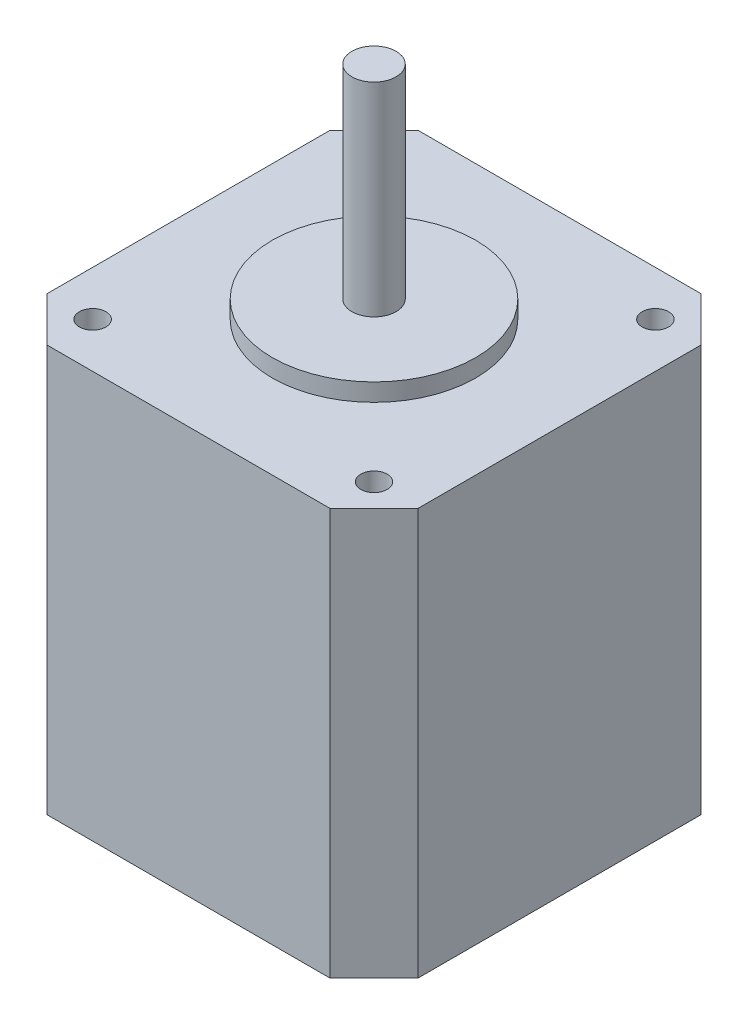
ISO-10303-21;
HEADER;
FILE_DESCRIPTION(('STEP AP214'),'2;1');
FILE_NAME('part.step','',(''),(''),'','','');
FILE_SCHEMA(('AUTOMOTIVE_DESIGN { 1 0 10303 214 1 1 1 1 }'));
ENDSEC;
DATA;
#1=APPLICATION_CONTEXT('core data for automotive mechanical design processes');
#2=APPLICATION_PROTOCOL_DEFINITION('international standard','automotive_design',2000,#1);
#3=PRODUCT_CONTEXT('',#1,'mechanical');
#4=PRODUCT('Part','Part','',(#3));
#5=PRODUCT_RELATED_PRODUCT_CATEGORY('part','',(#4));
#6=PRODUCT_DEFINITION_FORMATION('','',#4);
#7=PRODUCT_DEFINITION_CONTEXT('part definition',#1,'design');
#8=PRODUCT_DEFINITION('design','',#6,#7);
#9=PRODUCT_DEFINITION_SHAPE('','',#8);
#10=(LENGTH_UNIT() NAMED_UNIT(*) SI_UNIT(.MILLI.,.METRE.));
#11=(NAMED_UNIT(*) PLANE_ANGLE_UNIT() SI_UNIT($,.RADIAN.));
#12=(NAMED_UNIT(*) SI_UNIT($,.STERADIAN.) SOLID_ANGLE_UNIT());
#13=UNCERTAINTY_MEASURE_WITH_UNIT(LENGTH_MEASURE(1.E-05),#10,'distance_accuracy_value','');
#14=(GEOMETRIC_REPRESENTATION_CONTEXT(3) GLOBAL_UNCERTAINTY_ASSIGNED_CONTEXT((#13)) GLOBAL_UNIT_ASSIGNED_CONTEXT((#10,
#11,#12)) REPRESENTATION_CONTEXT('',''));
#15=CARTESIAN_POINT('',(0.,0.,0.));
#16=DIRECTION('',(0.,0.,1.));
#17=DIRECTION('',(1.,0.,0.));
#18=AXIS2_PLACEMENT_3D('',#15,#16,#17);
#19=CARTESIAN_POINT('',(0.,48.,0.));
#20=DIRECTION('',(0.,1.,0.));
#21=DIRECTION('',(0.,0.,1.));
#22=AXIS2_PLACEMENT_3D('',#19,#20,#21);
#23=PLANE('',#22);
#24=CARTESIAN_POINT('',(0.,48.,0.));
#25=DIRECTION('',(0.,1.,0.));
#26=DIRECTION('',(0.,0.,1.));
#27=AXIS2_PLACEMENT_3D('',#24,#25,#26);
#28=CIRCLE('',#27,11.5);
#29=CARTESIAN_POINT('',(0.,48.,11.5));
#30=VERTEX_POINT('',#29);
#31=EDGE_CURVE('E178',#30,#30,#28,.T.);
#32=ORIENTED_EDGE('',*,*,#31,.T.);
#33=EDGE_LOOP('',(#32));
#34=FACE_BOUND('',#33,.T.);
#35=CARTESIAN_POINT('',(0.,48.,0.));
#36=DIRECTION('',(0.,1.,0.));
#37=DIRECTION('',(0.,0.,1.));
#38=AXIS2_PLACEMENT_3D('',#35,#36,#37);
#39=CIRCLE('',#38,2.5);
#40=CARTESIAN_POINT('',(0.,48.,2.5));
#41=VERTEX_POINT('',#40);
#42=EDGE_CURVE('E37',#41,#41,#39,.F.);
#43=ORIENTED_EDGE('',*,*,#42,.T.);
#44=EDGE_LOOP('',(#43));
#45=FACE_BOUND('',#44,.T.);
#46=ADVANCED_FACE('F33',(#34,#45),#23,.T.);
#47=CARTESIAN_POINT('',(0.,46.,0.));
#48=DIRECTION('',(0.,-1.,0.));
#49=DIRECTION('',(0.,0.,-1.));
#50=AXIS2_PLACEMENT_3D('',#47,#48,#49);
#51=PLANE('',#50);
#52=CARTESIAN_POINT('',(-15.9099025766973,46.,15.9099025766973));
#53=DIRECTION('',(0.,1.,0.));
#54=DIRECTION('',(0.,0.,1.));
#55=AXIS2_PLACEMENT_3D('',#52,#53,#54);
#56=CIRCLE('',#55,1.5);
#57=CARTESIAN_POINT('',(-15.9099025766973,46.,17.4099025766973));
#58=VERTEX_POINT('',#57);
#59=EDGE_CURVE('E212',#58,#58,#56,.T.);
#60=ORIENTED_EDGE('',*,*,#59,.F.);
#61=EDGE_LOOP('',(#60));
#62=FACE_BOUND('',#61,.T.);
#63=CARTESIAN_POINT('',(15.9099025766973,46.,15.9099025766973));
#64=DIRECTION('',(0.,1.,0.));
#65=DIRECTION('',(0.,0.,1.));
#66=AXIS2_PLACEMENT_3D('',#63,#64,#65);
#67=CIRCLE('',#66,1.5);
#68=CARTESIAN_POINT('',(15.9099025766973,46.,17.4099025766973));
#69=VERTEX_POINT('',#68);
#70=EDGE_CURVE('E206',#69,#69,#67,.T.);
#71=ORIENTED_EDGE('',*,*,#70,.F.);
#72=EDGE_LOOP('',(#71));
#73=FACE_BOUND('',#72,.T.);
#74=CARTESIAN_POINT('',(15.9099025766973,46.,-15.9099025766973));
#75=DIRECTION('',(0.,1.,0.));
#76=DIRECTION('',(0.,0.,1.));
#77=AXIS2_PLACEMENT_3D('',#74,#75,#76);
#78=CIRCLE('',#77,1.5);
#79=CARTESIAN_POINT('',(15.9099025766973,46.,-14.4099025766973));
#80=VERTEX_POINT('',#79);
#81=EDGE_CURVE('E200',#80,#80,#78,.T.);
#82=ORIENTED_EDGE('',*,*,#81,.F.);
#83=EDGE_LOOP('',(#82));
#84=FACE_BOUND('',#83,.T.);
#85=CARTESIAN_POINT('',(-15.9099025766973,46.,-15.9099025766973));
#86=DIRECTION('',(0.,1.,0.));
#87=DIRECTION('',(0.,0.,1.));
#88=AXIS2_PLACEMENT_3D('',#85,#86,#87);
#89=CIRCLE('',#88,1.5);
#90=CARTESIAN_POINT('',(-15.9099025766973,46.,-14.4099025766973));
#91=VERTEX_POINT('',#90);
#92=EDGE_CURVE('E194',#91,#91,#89,.T.);
#93=ORIENTED_EDGE('',*,*,#92,.F.);
#94=EDGE_LOOP('',(#93));
#95=FACE_BOUND('',#94,.T.);
#96=DIRECTION('',(-1.,0.,0.));
#97=VECTOR('',#96,1.);
#98=CARTESIAN_POINT('',(-21.,46.,-21.));
#99=LINE('',#98,#97);
#100=CARTESIAN_POINT('',(16.,46.,-21.));
#101=VERTEX_POINT('',#100);
#102=CARTESIAN_POINT('',(-16.,46.,-21.));
#103=VERTEX_POINT('',#102);
#104=EDGE_CURVE('E173',#101,#103,#99,.T.);
#105=ORIENTED_EDGE('',*,*,#104,.T.);
#106=DIRECTION('',(0.707106781186549,0.,-0.707106781186546));
#107=VECTOR('',#106,1.);
#108=CARTESIAN_POINT('',(-21.,46.,-16.));
#109=LINE('',#108,#107);
#110=CARTESIAN_POINT('',(-21.,46.,-16.));
#111=VERTEX_POINT('',#110);
#112=EDGE_CURVE('E148',#103,#111,#109,.F.);
#113=ORIENTED_EDGE('',*,*,#112,.T.);
#114=DIRECTION('',(0.,0.,1.));
#115=VECTOR('',#114,1.);
#116=CARTESIAN_POINT('',(-21.,46.,21.));
#117=LINE('',#116,#115);
#118=CARTESIAN_POINT('',(-21.,46.,16.));
#119=VERTEX_POINT('',#118);
#120=EDGE_CURVE('E119',#111,#119,#117,.T.);
#121=ORIENTED_EDGE('',*,*,#120,.T.);
#122=DIRECTION('',(-0.707106781186546,0.,-0.707106781186549));
#123=VECTOR('',#122,1.);
#124=CARTESIAN_POINT('',(-16.,46.,21.));
#125=LINE('',#124,#123);
#126=CARTESIAN_POINT('',(-16.,46.,21.));
#127=VERTEX_POINT('',#126);
#128=EDGE_CURVE('E55',#119,#127,#125,.F.);
#129=ORIENTED_EDGE('',*,*,#128,.T.);
#130=DIRECTION('',(1.,0.,0.));
#131=VECTOR('',#130,1.);
#132=CARTESIAN_POINT('',(-21.,46.,21.));
#133=LINE('',#132,#131);
#134=CARTESIAN_POINT('',(16.,46.,21.));
#135=VERTEX_POINT('',#134);
#136=EDGE_CURVE('E134',#127,#135,#133,.T.);
#137=ORIENTED_EDGE('',*,*,#136,.T.);
#138=DIRECTION('',(-0.707106781186549,0.,0.707106781186547));
#139=VECTOR('',#138,1.);
#140=CARTESIAN_POINT('',(21.,46.,16.));
#141=LINE('',#140,#139);
#142=CARTESIAN_POINT('',(21.,46.,16.));
#143=VERTEX_POINT('',#142);
#144=EDGE_CURVE('E144',#135,#143,#141,.F.);
#145=ORIENTED_EDGE('',*,*,#144,.T.);
#146=DIRECTION('',(0.,0.,-1.));
#147=VECTOR('',#146,1.);
#148=CARTESIAN_POINT('',(21.,46.,21.));
#149=LINE('',#148,#147);
#150=CARTESIAN_POINT('',(21.,46.,-16.));
#151=VERTEX_POINT('',#150);
#152=EDGE_CURVE('E128',#143,#151,#149,.T.);
#153=ORIENTED_EDGE('',*,*,#152,.T.);
#154=DIRECTION('',(0.707106781186547,0.,0.707106781186549));
#155=VECTOR('',#154,1.);
#156=CARTESIAN_POINT('',(16.,46.,-21.));
#157=LINE('',#156,#155);
#158=EDGE_CURVE('E146',#151,#101,#157,.F.);
#159=ORIENTED_EDGE('',*,*,#158,.T.);
#160=EDGE_LOOP('',(#105,#113,#121,#129,#137,#145,#153,#159));
#161=FACE_BOUND('',#160,.T.);
#162=CARTESIAN_POINT('',(0.,46.,0.));
#163=DIRECTION('',(0.,-1.,0.));
#164=DIRECTION('',(0.,0.,-1.));
#165=AXIS2_PLACEMENT_3D('',#162,#163,#164);
#166=CIRCLE('',#165,11.5);
#167=CARTESIAN_POINT('',(0.,46.,-11.5));
#168=VERTEX_POINT('',#167);
#169=EDGE_CURVE('E11',#168,#168,#166,.F.);
#170=ORIENTED_EDGE('',*,*,#169,.F.);
#171=EDGE_LOOP('',(#170));
#172=FACE_BOUND('',#171,.T.);
#173=ADVANCED_FACE('F227',(#62,#73,#84,#95,#161,#172),#51,.F.);
#174=CARTESIAN_POINT('',(21.,46.,21.));
#175=DIRECTION('',(-1.,0.,0.));
#176=DIRECTION('',(0.,0.,1.));
#177=AXIS2_PLACEMENT_3D('',#174,#175,#176);
#178=PLANE('',#177);
#179=DIRECTION('',(0.,0.,-1.));
#180=VECTOR('',#179,1.);
#181=CARTESIAN_POINT('',(21.,0.,21.));
#182=LINE('',#181,#180);
#183=CARTESIAN_POINT('',(21.,0.,16.));
#184=VERTEX_POINT('',#183);
#185=CARTESIAN_POINT('',(21.,0.,-16.));
#186=VERTEX_POINT('',#185);
#187=EDGE_CURVE('E130',#184,#186,#182,.T.);
#188=ORIENTED_EDGE('',*,*,#187,.T.);
#189=DIRECTION('',(0.,1.,0.));
#190=VECTOR('',#189,1.);
#191=CARTESIAN_POINT('',(21.,46.,-16.));
#192=LINE('',#191,#190);
#193=EDGE_CURVE('E153',#186,#151,#192,.T.);
#194=ORIENTED_EDGE('',*,*,#193,.T.);
#195=ORIENTED_EDGE('',*,*,#152,.F.);
#196=DIRECTION('',(0.,-1.,0.));
#197=VECTOR('',#196,1.);
#198=CARTESIAN_POINT('',(21.,46.,16.));
#199=LINE('',#198,#197);
#200=EDGE_CURVE('E150',#143,#184,#199,.T.);
#201=ORIENTED_EDGE('',*,*,#200,.T.);
#202=EDGE_LOOP('',(#188,#194,#195,#201));
#203=FACE_BOUND('',#202,.T.);
#204=ADVANCED_FACE('F169',(#203),#178,.F.);
#205=CARTESIAN_POINT('',(-21.,46.,-21.));
#206=DIRECTION('',(0.,0.,1.));
#207=DIRECTION('',(1.,0.,0.));
#208=AXIS2_PLACEMENT_3D('',#205,#206,#207);
#209=PLANE('',#208);
#210=DIRECTION('',(-1.,0.,0.));
#211=VECTOR('',#210,1.);
#212=CARTESIAN_POINT('',(-21.,0.,-21.));
#213=LINE('',#212,#211);
#214=CARTESIAN_POINT('',(16.,0.,-21.));
#215=VERTEX_POINT('',#214);
#216=CARTESIAN_POINT('',(-16.,0.,-21.));
#217=VERTEX_POINT('',#216);
#218=EDGE_CURVE('E126',#215,#217,#213,.T.);
#219=ORIENTED_EDGE('',*,*,#218,.T.);
#220=DIRECTION('',(0.,1.,0.));
#221=VECTOR('',#220,1.);
#222=CARTESIAN_POINT('',(-16.,46.,-21.));
#223=LINE('',#222,#221);
#224=EDGE_CURVE('E105',#217,#103,#223,.T.);
#225=ORIENTED_EDGE('',*,*,#224,.T.);
#226=ORIENTED_EDGE('',*,*,#104,.F.);
#227=DIRECTION('',(0.,-1.,0.));
#228=VECTOR('',#227,1.);
#229=CARTESIAN_POINT('',(16.,46.,-21.));
#230=LINE('',#229,#228);
#231=EDGE_CURVE('E110',#101,#215,#230,.T.);
#232=ORIENTED_EDGE('',*,*,#231,.T.);
#233=EDGE_LOOP('',(#219,#225,#226,#232));
#234=FACE_BOUND('',#233,.T.);
#235=ADVANCED_FACE('F387',(#234),#209,.F.);
#236=CARTESIAN_POINT('',(-21.,46.,21.));
#237=DIRECTION('',(1.,0.,0.));
#238=DIRECTION('',(0.,0.,-1.));
#239=AXIS2_PLACEMENT_3D('',#236,#237,#238);
#240=PLANE('',#239);
#241=ORIENTED_EDGE('',*,*,#120,.F.);
#242=DIRECTION('',(0.,-1.,0.));
#243=VECTOR('',#242,1.);
#244=CARTESIAN_POINT('',(-21.,46.,-16.));
#245=LINE('',#244,#243);
#246=CARTESIAN_POINT('',(-21.,0.,-16.));
#247=VERTEX_POINT('',#246);
#248=EDGE_CURVE('E104',#111,#247,#245,.T.);
#249=ORIENTED_EDGE('',*,*,#248,.T.);
#250=DIRECTION('',(0.,0.,1.));
#251=VECTOR('',#250,1.);
#252=CARTESIAN_POINT('',(-21.,0.,21.));
#253=LINE('',#252,#251);
#254=CARTESIAN_POINT('',(-21.,0.,16.));
#255=VERTEX_POINT('',#254);
#256=EDGE_CURVE('E117',#247,#255,#253,.T.);
#257=ORIENTED_EDGE('',*,*,#256,.T.);
#258=DIRECTION('',(0.,1.,0.));
#259=VECTOR('',#258,1.);
#260=CARTESIAN_POINT('',(-21.,46.,16.));
#261=LINE('',#260,#259);
#262=EDGE_CURVE('E121',#255,#119,#261,.T.);
#263=ORIENTED_EDGE('',*,*,#262,.T.);
#264=EDGE_LOOP('',(#241,#249,#257,#263));
#265=FACE_BOUND('',#264,.T.);
#266=ADVANCED_FACE('F116',(#265),#240,.F.);
#267=CARTESIAN_POINT('',(-21.,46.,21.));
#268=DIRECTION('',(0.,0.,-1.));
#269=DIRECTION('',(-1.,0.,0.));
#270=AXIS2_PLACEMENT_3D('',#267,#268,#269);
#271=PLANE('',#270);
#272=DIRECTION('',(1.,0.,0.));
#273=VECTOR('',#272,1.);
#274=CARTESIAN_POINT('',(-21.,0.,21.));
#275=LINE('',#274,#273);
#276=CARTESIAN_POINT('',(-16.,0.,21.));
#277=VERTEX_POINT('',#276);
#278=CARTESIAN_POINT('',(16.,0.,21.));
#279=VERTEX_POINT('',#278);
#280=EDGE_CURVE('E125',#277,#279,#275,.T.);
#281=ORIENTED_EDGE('',*,*,#280,.T.);
#282=DIRECTION('',(0.,1.,0.));
#283=VECTOR('',#282,1.);
#284=CARTESIAN_POINT('',(16.,46.,21.));
#285=LINE('',#284,#283);
#286=EDGE_CURVE('E42',#279,#135,#285,.T.);
#287=ORIENTED_EDGE('',*,*,#286,.T.);
#288=ORIENTED_EDGE('',*,*,#136,.F.);
#289=DIRECTION('',(0.,-1.,0.));
#290=VECTOR('',#289,1.);
#291=CARTESIAN_POINT('',(-16.,46.,21.));
#292=LINE('',#291,#290);
#293=EDGE_CURVE('E155',#127,#277,#292,.T.);
#294=ORIENTED_EDGE('',*,*,#293,.T.);
#295=EDGE_LOOP('',(#281,#287,#288,#294));
#296=FACE_BOUND('',#295,.T.);
#297=ADVANCED_FACE('F159',(#296),#271,.F.);
#298=CARTESIAN_POINT('',(0.,0.,0.));
#299=DIRECTION('',(0.,-1.,0.));
#300=DIRECTION('',(0.,0.,-1.));
#301=AXIS2_PLACEMENT_3D('',#298,#299,#300);
#302=PLANE('',#301);
#303=ORIENTED_EDGE('',*,*,#256,.F.);
#304=DIRECTION('',(-0.707106781186549,0.,0.707106781186546));
#305=VECTOR('',#304,1.);
#306=CARTESIAN_POINT('',(-18.5,0.,-18.5));
#307=LINE('',#306,#305);
#308=EDGE_CURVE('E100',#247,#217,#307,.F.);
#309=ORIENTED_EDGE('',*,*,#308,.T.);
#310=ORIENTED_EDGE('',*,*,#218,.F.);
#311=DIRECTION('',(-0.707106781186547,0.,-0.707106781186549));
#312=VECTOR('',#311,1.);
#313=CARTESIAN_POINT('',(18.5,0.,-18.5));
#314=LINE('',#313,#312);
#315=EDGE_CURVE('E111',#215,#186,#314,.F.);
#316=ORIENTED_EDGE('',*,*,#315,.T.);
#317=ORIENTED_EDGE('',*,*,#187,.F.);
#318=DIRECTION('',(0.707106781186549,0.,-0.707106781186547));
#319=VECTOR('',#318,1.);
#320=CARTESIAN_POINT('',(18.5,0.,18.5));
#321=LINE('',#320,#319);
#322=EDGE_CURVE('E137',#184,#279,#321,.F.);
#323=ORIENTED_EDGE('',*,*,#322,.T.);
#324=ORIENTED_EDGE('',*,*,#280,.F.);
#325=DIRECTION('',(0.707106781186546,0.,0.707106781186549));
#326=VECTOR('',#325,1.);
#327=CARTESIAN_POINT('',(-18.5,0.,18.5));
#328=LINE('',#327,#326);
#329=EDGE_CURVE('E120',#277,#255,#328,.F.);
#330=ORIENTED_EDGE('',*,*,#329,.T.);
#331=EDGE_LOOP('',(#303,#309,#310,#316,#317,#323,#324,#330));
#332=FACE_BOUND('',#331,.T.);
#333=ADVANCED_FACE('F123',(#332),#302,.T.);
#334=CARTESIAN_POINT('',(-21.,46.,-16.));
#335=DIRECTION('',(0.707106781186546,0.,0.707106781186549));
#336=DIRECTION('',(0.,-1.,0.));
#337=AXIS2_PLACEMENT_3D('',#334,#335,#336);
#338=PLANE('',#337);
#339=ORIENTED_EDGE('',*,*,#112,.F.);
#340=ORIENTED_EDGE('',*,*,#224,.F.);
#341=ORIENTED_EDGE('',*,*,#308,.F.);
#342=ORIENTED_EDGE('',*,*,#248,.F.);
#343=EDGE_LOOP('',(#339,#340,#341,#342));
#344=FACE_BOUND('',#343,.T.);
#345=ADVANCED_FACE('F103',(#344),#338,.F.);
#346=CARTESIAN_POINT('',(16.,46.,-21.));
#347=DIRECTION('',(-0.707106781186549,0.,0.707106781186547));
#348=DIRECTION('',(0.,-1.,0.));
#349=AXIS2_PLACEMENT_3D('',#346,#347,#348);
#350=PLANE('',#349);
#351=ORIENTED_EDGE('',*,*,#158,.F.);
#352=ORIENTED_EDGE('',*,*,#193,.F.);
#353=ORIENTED_EDGE('',*,*,#315,.F.);
#354=ORIENTED_EDGE('',*,*,#231,.F.);
#355=EDGE_LOOP('',(#351,#352,#353,#354));
#356=FACE_BOUND('',#355,.T.);
#357=ADVANCED_FACE('F346',(#356),#350,.F.);
#358=CARTESIAN_POINT('',(21.,46.,16.));
#359=DIRECTION('',(-0.707106781186547,0.,-0.707106781186549));
#360=DIRECTION('',(0.,-1.,0.));
#361=AXIS2_PLACEMENT_3D('',#358,#359,#360);
#362=PLANE('',#361);
#363=ORIENTED_EDGE('',*,*,#144,.F.);
#364=ORIENTED_EDGE('',*,*,#286,.F.);
#365=ORIENTED_EDGE('',*,*,#322,.F.);
#366=ORIENTED_EDGE('',*,*,#200,.F.);
#367=EDGE_LOOP('',(#363,#364,#365,#366));
#368=FACE_BOUND('',#367,.T.);
#369=ADVANCED_FACE('F166',(#368),#362,.F.);
#370=CARTESIAN_POINT('',(-16.,46.,21.));
#371=DIRECTION('',(0.707106781186549,0.,-0.707106781186546));
#372=DIRECTION('',(0.,-1.,0.));
#373=AXIS2_PLACEMENT_3D('',#370,#371,#372);
#374=PLANE('',#373);
#375=ORIENTED_EDGE('',*,*,#128,.F.);
#376=ORIENTED_EDGE('',*,*,#262,.F.);
#377=ORIENTED_EDGE('',*,*,#329,.F.);
#378=ORIENTED_EDGE('',*,*,#293,.F.);
#379=EDGE_LOOP('',(#375,#376,#377,#378));
#380=FACE_BOUND('',#379,.T.);
#381=ADVANCED_FACE('F35',(#380),#374,.F.);
#382=CARTESIAN_POINT('',(0.,48.,0.));
#383=DIRECTION('',(0.,-1.,0.));
#384=DIRECTION('',(0.,0.,-1.));
#385=AXIS2_PLACEMENT_3D('',#382,#383,#384);
#386=CYLINDRICAL_SURFACE('',#385,11.5);
#387=ORIENTED_EDGE('',*,*,#31,.F.);
#388=EDGE_LOOP('',(#387));
#389=FACE_BOUND('',#388,.T.);
#390=ORIENTED_EDGE('',*,*,#169,.T.);
#391=EDGE_LOOP('',(#390));
#392=FACE_BOUND('',#391,.T.);
#393=ADVANCED_FACE('F240',(#389,#392),#386,.T.);
#394=CARTESIAN_POINT('',(0.,71.,0.));
#395=DIRECTION('',(0.,-1.,0.));
#396=DIRECTION('',(0.,0.,-1.));
#397=AXIS2_PLACEMENT_3D('',#394,#395,#396);
#398=CYLINDRICAL_SURFACE('',#397,2.5);
#399=ORIENTED_EDGE('',*,*,#42,.F.);
#400=EDGE_LOOP('',(#399));
#401=FACE_BOUND('',#400,.T.);
#402=CARTESIAN_POINT('',(0.,71.,0.));
#403=DIRECTION('',(0.,1.,0.));
#404=DIRECTION('',(0.,0.,1.));
#405=AXIS2_PLACEMENT_3D('',#402,#403,#404);
#406=CIRCLE('',#405,2.5);
#407=CARTESIAN_POINT('',(0.,71.,2.5));
#408=VERTEX_POINT('',#407);
#409=EDGE_CURVE('E186',#408,#408,#406,.T.);
#410=ORIENTED_EDGE('',*,*,#409,.F.);
#411=EDGE_LOOP('',(#410));
#412=FACE_BOUND('',#411,.T.);
#413=ADVANCED_FACE('F242',(#401,#412),#398,.T.);
#414=CARTESIAN_POINT('',(0.,71.,0.));
#415=DIRECTION('',(0.,1.,0.));
#416=DIRECTION('',(0.,0.,1.));
#417=AXIS2_PLACEMENT_3D('',#414,#415,#416);
#418=PLANE('',#417);
#419=ORIENTED_EDGE('',*,*,#409,.T.);
#420=EDGE_LOOP('',(#419));
#421=FACE_BOUND('',#420,.T.);
#422=ADVANCED_FACE('F249',(#421),#418,.T.);
#423=CARTESIAN_POINT('',(-15.9099025766973,41.,-15.9099025766973));
#424=DIRECTION('',(0.,1.,0.));
#425=DIRECTION('',(0.,0.,1.));
#426=AXIS2_PLACEMENT_3D('',#423,#424,#425);
#427=CYLINDRICAL_SURFACE('',#426,1.5);
#428=CARTESIAN_POINT('',(-15.9099025766973,41.,-15.9099025766973));
#429=DIRECTION('',(0.,1.,0.));
#430=DIRECTION('',(0.,0.,1.));
#431=AXIS2_PLACEMENT_3D('',#428,#429,#430);
#432=CIRCLE('',#431,1.5);
#433=CARTESIAN_POINT('',(-15.9099025766973,41.,-14.4099025766973));
#434=VERTEX_POINT('',#433);
#435=EDGE_CURVE('E190',#434,#434,#432,.T.);
#436=ORIENTED_EDGE('',*,*,#435,.F.);
#437=EDGE_LOOP('',(#436));
#438=FACE_BOUND('',#437,.T.);
#439=ORIENTED_EDGE('',*,*,#92,.T.);
#440=EDGE_LOOP('',(#439));
#441=FACE_BOUND('',#440,.T.);
#442=ADVANCED_FACE('F259',(#438,#441),#427,.F.);
#443=CARTESIAN_POINT('',(-15.9099025766973,41.,-15.9099025766973));
#444=DIRECTION('',(0.,1.,0.));
#445=DIRECTION('',(0.,0.,1.));
#446=AXIS2_PLACEMENT_3D('',#443,#444,#445);
#447=PLANE('',#446);
#448=ORIENTED_EDGE('',*,*,#435,.T.);
#449=EDGE_LOOP('',(#448));
#450=FACE_BOUND('',#449,.T.);
#451=ADVANCED_FACE('F262',(#450),#447,.T.);
#452=CARTESIAN_POINT('',(15.9099025766973,41.,-15.9099025766973));
#453=DIRECTION('',(0.,1.,0.));
#454=DIRECTION('',(0.,0.,1.));
#455=AXIS2_PLACEMENT_3D('',#452,#453,#454);
#456=CYLINDRICAL_SURFACE('',#455,1.5);
#457=CARTESIAN_POINT('',(15.9099025766973,41.,-15.9099025766973));
#458=DIRECTION('',(0.,1.,0.));
#459=DIRECTION('',(0.,0.,1.));
#460=AXIS2_PLACEMENT_3D('',#457,#458,#459);
#461=CIRCLE('',#460,1.5);
#462=CARTESIAN_POINT('',(15.9099025766973,41.,-14.4099025766973));
#463=VERTEX_POINT('',#462);
#464=EDGE_CURVE('E198',#463,#463,#461,.T.);
#465=ORIENTED_EDGE('',*,*,#464,.F.);
#466=EDGE_LOOP('',(#465));
#467=FACE_BOUND('',#466,.T.);
#468=ORIENTED_EDGE('',*,*,#81,.T.);
#469=EDGE_LOOP('',(#468));
#470=FACE_BOUND('',#469,.T.);
#471=ADVANCED_FACE('F266',(#467,#470),#456,.F.);
#472=CARTESIAN_POINT('',(15.9099025766973,41.,-15.9099025766973));
#473=DIRECTION('',(0.,1.,0.));
#474=DIRECTION('',(0.,0.,1.));
#475=AXIS2_PLACEMENT_3D('',#472,#473,#474);
#476=PLANE('',#475);
#477=ORIENTED_EDGE('',*,*,#464,.T.);
#478=EDGE_LOOP('',(#477));
#479=FACE_BOUND('',#478,.T.);
#480=ADVANCED_FACE('F270',(#479),#476,.T.);
#481=CARTESIAN_POINT('',(15.9099025766973,41.,15.9099025766973));
#482=DIRECTION('',(0.,1.,0.));
#483=DIRECTION('',(0.,0.,1.));
#484=AXIS2_PLACEMENT_3D('',#481,#482,#483);
#485=CYLINDRICAL_SURFACE('',#484,1.5);
#486=CARTESIAN_POINT('',(15.9099025766973,41.,15.9099025766973));
#487=DIRECTION('',(0.,1.,0.));
#488=DIRECTION('',(0.,0.,1.));
#489=AXIS2_PLACEMENT_3D('',#486,#487,#488);
#490=CIRCLE('',#489,1.5);
#491=CARTESIAN_POINT('',(15.9099025766973,41.,17.4099025766973));
#492=VERTEX_POINT('',#491);
#493=EDGE_CURVE('E203',#492,#492,#490,.T.);
#494=ORIENTED_EDGE('',*,*,#493,.F.);
#495=EDGE_LOOP('',(#494));
#496=FACE_BOUND('',#495,.T.);
#497=ORIENTED_EDGE('',*,*,#70,.T.);
#498=EDGE_LOOP('',(#497));
#499=FACE_BOUND('',#498,.T.);
#500=ADVANCED_FACE('F274',(#496,#499),#485,.F.);
#501=CARTESIAN_POINT('',(15.9099025766973,41.,15.9099025766973));
#502=DIRECTION('',(0.,1.,0.));
#503=DIRECTION('',(0.,0.,1.));
#504=AXIS2_PLACEMENT_3D('',#501,#502,#503);
#505=PLANE('',#504);
#506=ORIENTED_EDGE('',*,*,#493,.T.);
#507=EDGE_LOOP('',(#506));
#508=FACE_BOUND('',#507,.T.);
#509=ADVANCED_FACE('F223',(#508),#505,.T.);
#510=CARTESIAN_POINT('',(-15.9099025766973,41.,15.9099025766973));
#511=DIRECTION('',(0.,1.,0.));
#512=DIRECTION('',(0.,0.,1.));
#513=AXIS2_PLACEMENT_3D('',#510,#511,#512);
#514=CYLINDRICAL_SURFACE('',#513,1.5);
#515=CARTESIAN_POINT('',(-15.9099025766973,41.,15.9099025766973));
#516=DIRECTION('',(0.,1.,0.));
#517=DIRECTION('',(0.,0.,1.));
#518=AXIS2_PLACEMENT_3D('',#515,#516,#517);
#519=CIRCLE('',#518,1.5);
#520=CARTESIAN_POINT('',(-15.9099025766973,41.,17.4099025766973));
#521=VERTEX_POINT('',#520);
#522=EDGE_CURVE('E209',#521,#521,#519,.T.);
#523=ORIENTED_EDGE('',*,*,#522,.F.);
#524=EDGE_LOOP('',(#523));
#525=FACE_BOUND('',#524,.T.);
#526=ORIENTED_EDGE('',*,*,#59,.T.);
#527=EDGE_LOOP('',(#526));
#528=FACE_BOUND('',#527,.T.);
#529=ADVANCED_FACE('F220',(#525,#528),#514,.F.);
#530=CARTESIAN_POINT('',(-15.9099025766973,41.,15.9099025766973));
#531=DIRECTION('',(0.,1.,0.));
#532=DIRECTION('',(0.,0.,1.));
#533=AXIS2_PLACEMENT_3D('',#530,#531,#532);
#534=PLANE('',#533);
#535=ORIENTED_EDGE('',*,*,#522,.T.);
#536=EDGE_LOOP('',(#535));
#537=FACE_BOUND('',#536,.T.);
#538=ADVANCED_FACE('F218',(#537),#534,.T.);
#539=CLOSED_SHELL('',(#46,#173,#204,#235,#266,#297,#333,#345,#357,#369,#381,#393,#413,#422,#442,
#451,#471,#480,#500,#509,#529,#538));
#540=MANIFOLD_SOLID_BREP('B2',#539);
#541=ADVANCED_BREP_SHAPE_REPRESENTATION('',(#18,#540),#14);
#542=SHAPE_DEFINITION_REPRESENTATION(#9,#541);
ENDSEC;
END-ISO-10303-21;
